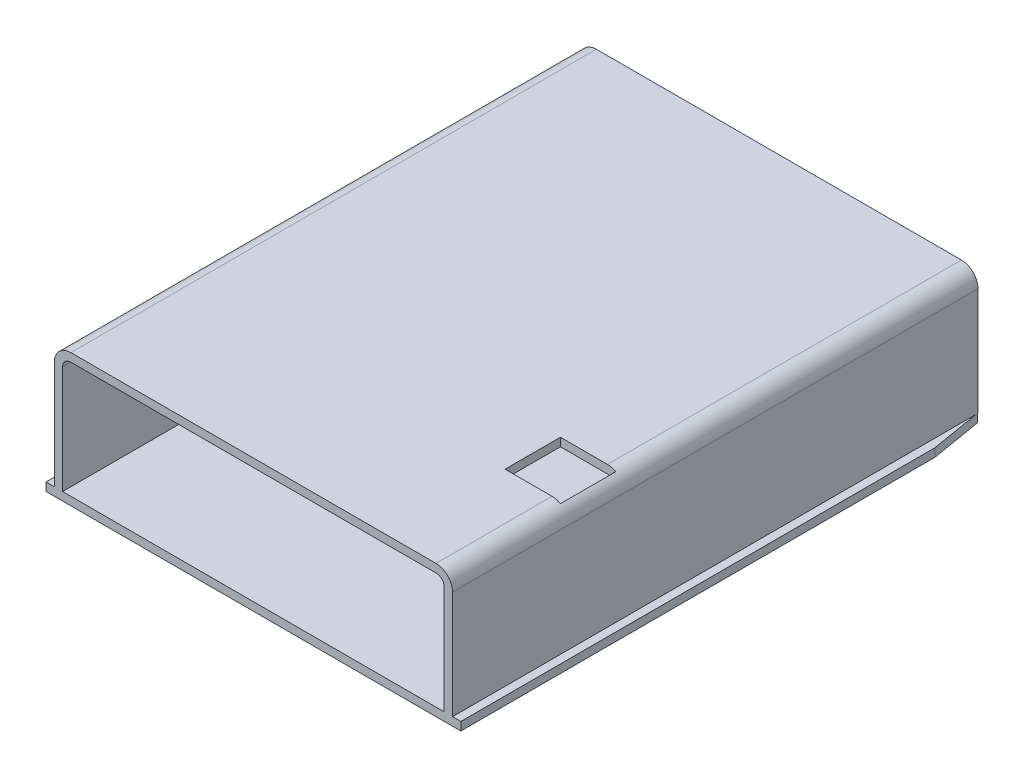
ISO-10303-21;
HEADER;
FILE_DESCRIPTION(('STEP AP214'),'2;1');
FILE_NAME('part.step','',(''),(''),'','','');
FILE_SCHEMA(('AUTOMOTIVE_DESIGN { 1 0 10303 214 1 1 1 1 }'));
ENDSEC;
DATA;
#1=APPLICATION_CONTEXT('core data for automotive mechanical design processes');
#2=APPLICATION_PROTOCOL_DEFINITION('international standard','automotive_design',2000,#1);
#3=PRODUCT_CONTEXT('',#1,'mechanical');
#4=PRODUCT('Part','Part','',(#3));
#5=PRODUCT_RELATED_PRODUCT_CATEGORY('part','',(#4));
#6=PRODUCT_DEFINITION_FORMATION('','',#4);
#7=PRODUCT_DEFINITION_CONTEXT('part definition',#1,'design');
#8=PRODUCT_DEFINITION('design','',#6,#7);
#9=PRODUCT_DEFINITION_SHAPE('','',#8);
#10=(LENGTH_UNIT() NAMED_UNIT(*) SI_UNIT(.MILLI.,.METRE.));
#11=(NAMED_UNIT(*) PLANE_ANGLE_UNIT() SI_UNIT($,.RADIAN.));
#12=(NAMED_UNIT(*) SI_UNIT($,.STERADIAN.) SOLID_ANGLE_UNIT());
#13=UNCERTAINTY_MEASURE_WITH_UNIT(LENGTH_MEASURE(1.E-05),#10,'distance_accuracy_value','');
#14=(GEOMETRIC_REPRESENTATION_CONTEXT(3) GLOBAL_UNCERTAINTY_ASSIGNED_CONTEXT((#13)) GLOBAL_UNIT_ASSIGNED_CONTEXT((#10,
#11,#12)) REPRESENTATION_CONTEXT('',''));
#15=CARTESIAN_POINT('',(0.,0.,0.));
#16=DIRECTION('',(0.,0.,1.));
#17=DIRECTION('',(1.,0.,0.));
#18=AXIS2_PLACEMENT_3D('',#15,#16,#17);
#19=CARTESIAN_POINT('',(1.5,22.5,2.));
#20=DIRECTION('',(-1.,0.,0.));
#21=DIRECTION('',(0.,-1.,0.));
#22=AXIS2_PLACEMENT_3D('',#19,#20,#21);
#23=PLANE('',#22);
#24=DIRECTION('',(0.,-1.,0.));
#25=VECTOR('',#24,1.);
#26=CARTESIAN_POINT('',(1.5,17.5,17.));
#27=LINE('',#26,#25);
#28=CARTESIAN_POINT('',(1.5,21.,17.));
#29=VERTEX_POINT('',#28);
#30=CARTESIAN_POINT('',(1.5,17.5,17.));
#31=VERTEX_POINT('',#30);
#32=EDGE_CURVE('E443',#29,#31,#27,.T.);
#33=ORIENTED_EDGE('',*,*,#32,.F.);
#34=DIRECTION('',(0.,0.,1.));
#35=VECTOR('',#34,1.);
#36=CARTESIAN_POINT('',(1.5,21.,95.));
#37=LINE('',#36,#35);
#38=CARTESIAN_POINT('',(1.5,21.,95.));
#39=VERTEX_POINT('',#38);
#40=EDGE_CURVE('E385',#29,#39,#37,.T.);
#41=ORIENTED_EDGE('',*,*,#40,.T.);
#42=DIRECTION('',(0.,-1.,0.));
#43=VECTOR('',#42,1.);
#44=CARTESIAN_POINT('',(1.5,22.5,95.));
#45=LINE('',#44,#43);
#46=CARTESIAN_POINT('',(1.5,1.5,95.));
#47=VERTEX_POINT('',#46);
#48=EDGE_CURVE('E617',#39,#47,#45,.T.);
#49=ORIENTED_EDGE('',*,*,#48,.T.);
#50=DIRECTION('',(0.,0.,1.));
#51=VECTOR('',#50,1.);
#52=CARTESIAN_POINT('',(1.5,1.5,2.));
#53=LINE('',#52,#51);
#54=CARTESIAN_POINT('',(1.5,1.5,2.));
#55=VERTEX_POINT('',#54);
#56=EDGE_CURVE('E629',#55,#47,#53,.T.);
#57=ORIENTED_EDGE('',*,*,#56,.F.);
#58=DIRECTION('',(0.,-1.,0.));
#59=VECTOR('',#58,1.);
#60=CARTESIAN_POINT('',(1.5,22.5,2.));
#61=LINE('',#60,#59);
#62=CARTESIAN_POINT('',(1.5,17.5,2.));
#63=VERTEX_POINT('',#62);
#64=EDGE_CURVE('E618',#63,#55,#61,.T.);
#65=ORIENTED_EDGE('',*,*,#64,.F.);
#66=DIRECTION('',(0.,0.,-1.));
#67=VECTOR('',#66,1.);
#68=CARTESIAN_POINT('',(1.5,17.5,16.));
#69=LINE('',#68,#67);
#70=EDGE_CURVE('E591',#31,#63,#69,.T.);
#71=ORIENTED_EDGE('',*,*,#70,.F.);
#72=EDGE_LOOP('',(#33,#41,#49,#57,#65,#71));
#73=FACE_BOUND('',#72,.T.);
#74=ADVANCED_FACE('F33',(#73),#23,.F.);
#75=CARTESIAN_POINT('',(1.5,22.5,2.));
#76=DIRECTION('',(0.,1.,0.));
#77=DIRECTION('',(0.,0.,1.));
#78=AXIS2_PLACEMENT_3D('',#75,#76,#77);
#79=PLANE('',#78);
#80=DIRECTION('',(-1.,0.,0.));
#81=VECTOR('',#80,1.);
#82=CARTESIAN_POINT('',(1.5,22.5,95.));
#83=LINE('',#82,#81);
#84=CARTESIAN_POINT('',(69.,22.5,95.));
#85=VERTEX_POINT('',#84);
#86=CARTESIAN_POINT('',(3.,22.5,95.));
#87=VERTEX_POINT('',#86);
#88=EDGE_CURVE('E621',#85,#87,#83,.T.);
#89=ORIENTED_EDGE('',*,*,#88,.T.);
#90=DIRECTION('',(0.,0.,1.));
#91=VECTOR('',#90,1.);
#92=CARTESIAN_POINT('',(3.,22.5,17.));
#93=LINE('',#92,#91);
#94=CARTESIAN_POINT('',(3.,22.5,17.));
#95=VERTEX_POINT('',#94);
#96=EDGE_CURVE('E394',#87,#95,#93,.F.);
#97=ORIENTED_EDGE('',*,*,#96,.T.);
#98=DIRECTION('',(-1.,0.,0.));
#99=VECTOR('',#98,1.);
#100=CARTESIAN_POINT('',(1.5,22.5,17.));
#101=LINE('',#100,#99);
#102=CARTESIAN_POINT('',(3.1,22.5,17.));
#103=VERTEX_POINT('',#102);
#104=EDGE_CURVE('E440',#103,#95,#101,.T.);
#105=ORIENTED_EDGE('',*,*,#104,.F.);
#106=DIRECTION('',(0.,0.,-1.));
#107=VECTOR('',#106,1.);
#108=CARTESIAN_POINT('',(3.1,22.5,17.));
#109=LINE('',#108,#107);
#110=CARTESIAN_POINT('',(3.1,22.5,16.));
#111=VERTEX_POINT('',#110);
#112=EDGE_CURVE('E448',#103,#111,#109,.T.);
#113=ORIENTED_EDGE('',*,*,#112,.T.);
#114=DIRECTION('',(-1.,0.,0.));
#115=VECTOR('',#114,1.);
#116=CARTESIAN_POINT('',(1.5,22.5,16.));
#117=LINE('',#116,#115);
#118=CARTESIAN_POINT('',(1.5,22.5,16.));
#119=VERTEX_POINT('',#118);
#120=EDGE_CURVE('E456',#111,#119,#117,.T.);
#121=ORIENTED_EDGE('',*,*,#120,.T.);
#122=DIRECTION('',(0.,0.,1.));
#123=VECTOR('',#122,1.);
#124=CARTESIAN_POINT('',(1.5,22.5,2.));
#125=LINE('',#124,#123);
#126=CARTESIAN_POINT('',(1.5,22.5,0.));
#127=VERTEX_POINT('',#126);
#128=EDGE_CURVE('E358',#127,#119,#125,.T.);
#129=ORIENTED_EDGE('',*,*,#128,.F.);
#130=DIRECTION('',(1.,0.,0.));
#131=VECTOR('',#130,1.);
#132=CARTESIAN_POINT('',(1.5,22.5,0.));
#133=LINE('',#132,#131);
#134=CARTESIAN_POINT('',(27.24,22.5,0.));
#135=VERTEX_POINT('',#134);
#136=EDGE_CURVE('E571',#127,#135,#133,.T.);
#137=ORIENTED_EDGE('',*,*,#136,.T.);
#138=DIRECTION('',(0.,0.,-1.));
#139=VECTOR('',#138,1.);
#140=CARTESIAN_POINT('',(27.24,22.5,16.));
#141=LINE('',#140,#139);
#142=CARTESIAN_POINT('',(27.24,22.5,16.));
#143=VERTEX_POINT('',#142);
#144=EDGE_CURVE('E565',#143,#135,#141,.T.);
#145=ORIENTED_EDGE('',*,*,#144,.F.);
#146=DIRECTION('',(-1.,0.,0.));
#147=VECTOR('',#146,1.);
#148=CARTESIAN_POINT('',(29.24,22.5,16.));
#149=LINE('',#148,#147);
#150=CARTESIAN_POINT('',(26.24,22.5,16.));
#151=VERTEX_POINT('',#150);
#152=EDGE_CURVE('E425',#143,#151,#149,.T.);
#153=ORIENTED_EDGE('',*,*,#152,.T.);
#154=DIRECTION('',(0.,0.,-1.));
#155=VECTOR('',#154,1.);
#156=CARTESIAN_POINT('',(26.24,22.5,17.));
#157=LINE('',#156,#155);
#158=CARTESIAN_POINT('',(26.24,22.5,17.));
#159=VERTEX_POINT('',#158);
#160=EDGE_CURVE('E466',#159,#151,#157,.T.);
#161=ORIENTED_EDGE('',*,*,#160,.F.);
#162=DIRECTION('',(-1.,0.,0.));
#163=VECTOR('',#162,1.);
#164=CARTESIAN_POINT('',(29.24,22.5,17.));
#165=LINE('',#164,#163);
#166=CARTESIAN_POINT('',(29.24,22.5,17.));
#167=VERTEX_POINT('',#166);
#168=EDGE_CURVE('E429',#167,#159,#165,.T.);
#169=ORIENTED_EDGE('',*,*,#168,.F.);
#170=DIRECTION('',(0.,0.,-1.));
#171=VECTOR('',#170,1.);
#172=CARTESIAN_POINT('',(29.24,22.5,16.));
#173=LINE('',#172,#171);
#174=CARTESIAN_POINT('',(29.24,22.5,2.));
#175=VERTEX_POINT('',#174);
#176=EDGE_CURVE('E586',#167,#175,#173,.T.);
#177=ORIENTED_EDGE('',*,*,#176,.T.);
#178=DIRECTION('',(-1.,0.,0.));
#179=VECTOR('',#178,1.);
#180=CARTESIAN_POINT('',(1.5,22.5,2.));
#181=LINE('',#180,#179);
#182=CARTESIAN_POINT('',(69.,22.5,2.));
#183=VERTEX_POINT('',#182);
#184=EDGE_CURVE('E627',#183,#175,#181,.T.);
#185=ORIENTED_EDGE('',*,*,#184,.F.);
#186=DIRECTION('',(0.,0.,1.));
#187=VECTOR('',#186,1.);
#188=CARTESIAN_POINT('',(69.,22.5,64.));
#189=LINE('',#188,#187);
#190=CARTESIAN_POINT('',(69.,22.5,64.));
#191=VERTEX_POINT('',#190);
#192=EDGE_CURVE('E388',#183,#191,#189,.T.);
#193=ORIENTED_EDGE('',*,*,#192,.T.);
#194=DIRECTION('',(-1.,0.,0.));
#195=VECTOR('',#194,1.);
#196=CARTESIAN_POINT('',(1.5,22.5,64.));
#197=LINE('',#196,#195);
#198=CARTESIAN_POINT('',(60.5,22.5,64.));
#199=VERTEX_POINT('',#198);
#200=EDGE_CURVE('E615',#191,#199,#197,.T.);
#201=ORIENTED_EDGE('',*,*,#200,.T.);
#202=DIRECTION('',(0.,0.,1.));
#203=VECTOR('',#202,1.);
#204=CARTESIAN_POINT('',(60.4999999999999,22.5,1.99999999999996));
#205=LINE('',#204,#203);
#206=CARTESIAN_POINT('',(60.5,22.5,74.));
#207=VERTEX_POINT('',#206);
#208=EDGE_CURVE('E348',#199,#207,#205,.T.);
#209=ORIENTED_EDGE('',*,*,#208,.T.);
#210=DIRECTION('',(1.,0.,0.));
#211=VECTOR('',#210,1.);
#212=CARTESIAN_POINT('',(1.5,22.5,74.));
#213=LINE('',#212,#211);
#214=CARTESIAN_POINT('',(69.,22.5,74.));
#215=VERTEX_POINT('',#214);
#216=EDGE_CURVE('E604',#207,#215,#213,.T.);
#217=ORIENTED_EDGE('',*,*,#216,.T.);
#218=DIRECTION('',(0.,0.,1.));
#219=VECTOR('',#218,1.);
#220=CARTESIAN_POINT('',(69.,22.5,95.));
#221=LINE('',#220,#219);
#222=EDGE_CURVE('E391',#215,#85,#221,.T.);
#223=ORIENTED_EDGE('',*,*,#222,.T.);
#224=EDGE_LOOP('',(#89,#97,#105,#113,#121,#129,#137,#145,#153,#161,#169,#177,#185,#193,#201,
#209,#217,#223));
#225=FACE_BOUND('',#224,.T.);
#226=ADVANCED_FACE('F510',(#225),#79,.F.);
#227=CARTESIAN_POINT('',(0.,0.,95.));
#228=DIRECTION('',(1.,0.,0.));
#229=DIRECTION('',(0.,0.,-1.));
#230=AXIS2_PLACEMENT_3D('',#227,#228,#229);
#231=PLANE('',#230);
#232=DIRECTION('',(0.,-1.,0.));
#233=VECTOR('',#232,1.);
#234=CARTESIAN_POINT('',(0.,0.,95.));
#235=LINE('',#234,#233);
#236=CARTESIAN_POINT('',(0.,21.,95.));
#237=VERTEX_POINT('',#236);
#238=CARTESIAN_POINT('',(0.,1.5,95.));
#239=VERTEX_POINT('',#238);
#240=EDGE_CURVE('E341',#237,#239,#235,.T.);
#241=ORIENTED_EDGE('',*,*,#240,.F.);
#242=DIRECTION('',(0.,0.,-1.));
#243=VECTOR('',#242,1.);
#244=CARTESIAN_POINT('',(0.,21.,95.));
#245=LINE('',#244,#243);
#246=CARTESIAN_POINT('',(0.,21.,0.));
#247=VERTEX_POINT('',#246);
#248=EDGE_CURVE('E360',#237,#247,#245,.T.);
#249=ORIENTED_EDGE('',*,*,#248,.T.);
#250=DIRECTION('',(0.,-1.,0.));
#251=VECTOR('',#250,1.);
#252=CARTESIAN_POINT('',(0.,0.,0.));
#253=LINE('',#252,#251);
#254=CARTESIAN_POINT('',(0.,1.5,0.));
#255=VERTEX_POINT('',#254);
#256=EDGE_CURVE('E344',#247,#255,#253,.T.);
#257=ORIENTED_EDGE('',*,*,#256,.T.);
#258=DIRECTION('',(0.,0.,-1.));
#259=VECTOR('',#258,1.);
#260=CARTESIAN_POINT('',(0.,1.5,95.));
#261=LINE('',#260,#259);
#262=EDGE_CURVE('E303',#239,#255,#261,.T.);
#263=ORIENTED_EDGE('',*,*,#262,.F.);
#264=EDGE_LOOP('',(#241,#249,#257,#263));
#265=FACE_BOUND('',#264,.T.);
#266=ADVANCED_FACE('F489',(#265),#231,.F.);
#267=ORIENTED_EDGE('',*,*,#128,.T.);
#268=DIRECTION('',(0.,-1.,0.));
#269=VECTOR('',#268,1.);
#270=CARTESIAN_POINT('',(1.5,17.5,16.));
#271=LINE('',#270,#269);
#272=CARTESIAN_POINT('',(1.5,19.5,16.));
#273=VERTEX_POINT('',#272);
#274=EDGE_CURVE('E430',#119,#273,#271,.T.);
#275=ORIENTED_EDGE('',*,*,#274,.T.);
#276=DIRECTION('',(0.,0.,-1.));
#277=VECTOR('',#276,1.);
#278=CARTESIAN_POINT('',(1.5,19.5,16.));
#279=LINE('',#278,#277);
#280=CARTESIAN_POINT('',(1.5,19.5,0.));
#281=VERTEX_POINT('',#280);
#282=EDGE_CURVE('E577',#273,#281,#279,.T.);
#283=ORIENTED_EDGE('',*,*,#282,.T.);
#284=DIRECTION('',(0.,1.,0.));
#285=VECTOR('',#284,1.);
#286=CARTESIAN_POINT('',(1.5,22.5,0.));
#287=LINE('',#286,#285);
#288=EDGE_CURVE('E287',#281,#127,#287,.T.);
#289=ORIENTED_EDGE('',*,*,#288,.T.);
#290=EDGE_LOOP('',(#267,#275,#283,#289));
#291=FACE_BOUND('',#290,.T.);
#292=ADVANCED_FACE('F513',(#291),#23,.F.);
#293=CARTESIAN_POINT('',(0.,0.,2.));
#294=DIRECTION('',(0.,0.,1.));
#295=DIRECTION('',(1.,0.,0.));
#296=AXIS2_PLACEMENT_3D('',#293,#294,#295);
#297=PLANE('',#296);
#298=DIRECTION('',(0.,1.,0.));
#299=VECTOR('',#298,1.);
#300=CARTESIAN_POINT('',(70.5,22.5,2.));
#301=LINE('',#300,#299);
#302=CARTESIAN_POINT('',(70.5,1.5,2.));
#303=VERTEX_POINT('',#302);
#304=CARTESIAN_POINT('',(70.5,21.,2.));
#305=VERTEX_POINT('',#304);
#306=EDGE_CURVE('E624',#303,#305,#301,.T.);
#307=ORIENTED_EDGE('',*,*,#306,.T.);
#308=CARTESIAN_POINT('',(69.,21.,2.));
#309=DIRECTION('',(0.,0.,1.));
#310=DIRECTION('',(1.,0.,0.));
#311=AXIS2_PLACEMENT_3D('',#308,#309,#310);
#312=CIRCLE('',#311,1.5);
#313=EDGE_CURVE('E403',#305,#183,#312,.T.);
#314=ORIENTED_EDGE('',*,*,#313,.T.);
#315=ORIENTED_EDGE('',*,*,#184,.T.);
#316=DIRECTION('',(0.,1.,0.));
#317=VECTOR('',#316,1.);
#318=CARTESIAN_POINT('',(29.24,22.5,2.));
#319=LINE('',#318,#317);
#320=CARTESIAN_POINT('',(29.24,17.5,2.));
#321=VERTEX_POINT('',#320);
#322=EDGE_CURVE('E583',#321,#175,#319,.T.);
#323=ORIENTED_EDGE('',*,*,#322,.F.);
#324=DIRECTION('',(1.,0.,0.));
#325=VECTOR('',#324,1.);
#326=CARTESIAN_POINT('',(1.5,17.5,2.));
#327=LINE('',#326,#325);
#328=EDGE_CURVE('E579',#63,#321,#327,.T.);
#329=ORIENTED_EDGE('',*,*,#328,.F.);
#330=ORIENTED_EDGE('',*,*,#64,.T.);
#331=DIRECTION('',(1.,0.,0.));
#332=VECTOR('',#331,1.);
#333=CARTESIAN_POINT('',(1.5,1.5,2.));
#334=LINE('',#333,#332);
#335=EDGE_CURVE('E620',#55,#303,#334,.T.);
#336=ORIENTED_EDGE('',*,*,#335,.T.);
#337=EDGE_LOOP('',(#307,#314,#315,#323,#329,#330,#336));
#338=FACE_BOUND('',#337,.T.);
#339=ADVANCED_FACE('F523',(#338),#297,.T.);
#340=CARTESIAN_POINT('',(0.,0.,95.));
#341=DIRECTION('',(0.,1.,0.));
#342=DIRECTION('',(0.,0.,1.));
#343=AXIS2_PLACEMENT_3D('',#340,#341,#342);
#344=PLANE('',#343);
#345=DIRECTION('',(1.,0.,0.));
#346=VECTOR('',#345,1.);
#347=CARTESIAN_POINT('',(0.,0.,0.));
#348=LINE('',#347,#346);
#349=CARTESIAN_POINT('',(0.,0.,0.));
#350=VERTEX_POINT('',#349);
#351=CARTESIAN_POINT('',(71.9347971969597,0.,0.));
#352=VERTEX_POINT('',#351);
#353=EDGE_CURVE('E339',#350,#352,#348,.T.);
#354=ORIENTED_EDGE('',*,*,#353,.T.);
#355=DIRECTION('',(-0.166507387012407,0.,-0.986040207126617));
#356=VECTOR('',#355,1.);
#357=CARTESIAN_POINT('',(73.5,0.,9.26897553193839));
#358=LINE('',#357,#356);
#359=CARTESIAN_POINT('',(73.5,0.,9.26897553193839));
#360=VERTEX_POINT('',#359);
#361=EDGE_CURVE('E1013',#360,#352,#358,.T.);
#362=ORIENTED_EDGE('',*,*,#361,.F.);
#363=DIRECTION('',(0.,0.,-1.));
#364=VECTOR('',#363,1.);
#365=CARTESIAN_POINT('',(73.5,0.,95.));
#366=LINE('',#365,#364);
#367=CARTESIAN_POINT('',(73.5,0.,95.));
#368=VERTEX_POINT('',#367);
#369=EDGE_CURVE('E278',#368,#360,#366,.T.);
#370=ORIENTED_EDGE('',*,*,#369,.F.);
#371=DIRECTION('',(1.,0.,0.));
#372=VECTOR('',#371,1.);
#373=CARTESIAN_POINT('',(0.,0.,95.));
#374=LINE('',#373,#372);
#375=CARTESIAN_POINT('',(-1.5,0.,95.));
#376=VERTEX_POINT('',#375);
#377=EDGE_CURVE('E488',#376,#368,#374,.T.);
#378=ORIENTED_EDGE('',*,*,#377,.F.);
#379=DIRECTION('',(0.,0.,-1.));
#380=VECTOR('',#379,1.);
#381=CARTESIAN_POINT('',(-1.5,0.,95.));
#382=LINE('',#381,#380);
#383=CARTESIAN_POINT('',(-1.5,0.,9.26897553193839));
#384=VERTEX_POINT('',#383);
#385=EDGE_CURVE('E319',#376,#384,#382,.T.);
#386=ORIENTED_EDGE('',*,*,#385,.T.);
#387=DIRECTION('',(-0.159751830859126,0.,0.987157207610397));
#388=VECTOR('',#387,1.);
#389=CARTESIAN_POINT('',(0.,0.,0.));
#390=LINE('',#389,#388);
#391=EDGE_CURVE('E59',#350,#384,#390,.T.);
#392=ORIENTED_EDGE('',*,*,#391,.F.);
#393=EDGE_LOOP('',(#354,#362,#370,#378,#386,#392));
#394=FACE_BOUND('',#393,.T.);
#395=ADVANCED_FACE('F495',(#394),#344,.F.);
#396=CARTESIAN_POINT('',(72.,0.,95.));
#397=DIRECTION('',(-1.,0.,0.));
#398=DIRECTION('',(0.,0.,1.));
#399=AXIS2_PLACEMENT_3D('',#396,#397,#398);
#400=PLANE('',#399);
#401=DIRECTION('',(0.,1.,0.));
#402=VECTOR('',#401,1.);
#403=CARTESIAN_POINT('',(72.,0.,0.));
#404=LINE('',#403,#402);
#405=CARTESIAN_POINT('',(72.,1.5,0.));
#406=VERTEX_POINT('',#405);
#407=CARTESIAN_POINT('',(72.,21.,0.));
#408=VERTEX_POINT('',#407);
#409=EDGE_CURVE('E326',#406,#408,#404,.T.);
#410=ORIENTED_EDGE('',*,*,#409,.T.);
#411=DIRECTION('',(0.,0.,-1.));
#412=VECTOR('',#411,1.);
#413=CARTESIAN_POINT('',(72.,21.,95.));
#414=LINE('',#413,#412);
#415=CARTESIAN_POINT('',(72.,21.,95.));
#416=VERTEX_POINT('',#415);
#417=EDGE_CURVE('E383',#408,#416,#414,.F.);
#418=ORIENTED_EDGE('',*,*,#417,.T.);
#419=DIRECTION('',(0.,1.,0.));
#420=VECTOR('',#419,1.);
#421=CARTESIAN_POINT('',(72.,0.,95.));
#422=LINE('',#421,#420);
#423=CARTESIAN_POINT('',(72.,1.5,95.));
#424=VERTEX_POINT('',#423);
#425=EDGE_CURVE('E298',#424,#416,#422,.T.);
#426=ORIENTED_EDGE('',*,*,#425,.F.);
#427=DIRECTION('',(0.,0.,-1.));
#428=VECTOR('',#427,1.);
#429=CARTESIAN_POINT('',(72.,1.5,95.));
#430=LINE('',#429,#428);
#431=CARTESIAN_POINT('',(72.,1.5,0.386124523173742));
#432=VERTEX_POINT('',#431);
#433=EDGE_CURVE('E285',#424,#432,#430,.T.);
#434=ORIENTED_EDGE('',*,*,#433,.T.);
#435=EDGE_CURVE('E37',#432,#406,#430,.T.);
#436=ORIENTED_EDGE('',*,*,#435,.T.);
#437=EDGE_LOOP('',(#410,#418,#426,#434,#436));
#438=FACE_BOUND('',#437,.T.);
#439=ADVANCED_FACE('F325',(#438),#400,.F.);
#440=CARTESIAN_POINT('',(0.,24.,95.));
#441=DIRECTION('',(0.,-1.,0.));
#442=DIRECTION('',(0.,0.,-1.));
#443=AXIS2_PLACEMENT_3D('',#440,#441,#442);
#444=PLANE('',#443);
#445=DIRECTION('',(-1.,0.,0.));
#446=VECTOR('',#445,1.);
#447=CARTESIAN_POINT('',(0.,24.,0.));
#448=LINE('',#447,#446);
#449=CARTESIAN_POINT('',(69.,24.,0.));
#450=VERTEX_POINT('',#449);
#451=CARTESIAN_POINT('',(3.,24.,0.));
#452=VERTEX_POINT('',#451);
#453=EDGE_CURVE('E338',#450,#452,#448,.T.);
#454=ORIENTED_EDGE('',*,*,#453,.T.);
#455=DIRECTION('',(0.,0.,-1.));
#456=VECTOR('',#455,1.);
#457=CARTESIAN_POINT('',(3.,24.,95.));
#458=LINE('',#457,#456);
#459=CARTESIAN_POINT('',(3.,24.,95.));
#460=VERTEX_POINT('',#459);
#461=EDGE_CURVE('E371',#452,#460,#458,.F.);
#462=ORIENTED_EDGE('',*,*,#461,.T.);
#463=DIRECTION('',(-1.,0.,0.));
#464=VECTOR('',#463,1.);
#465=CARTESIAN_POINT('',(0.,24.,95.));
#466=LINE('',#465,#464);
#467=CARTESIAN_POINT('',(69.,24.,95.));
#468=VERTEX_POINT('',#467);
#469=EDGE_CURVE('E353',#468,#460,#466,.T.);
#470=ORIENTED_EDGE('',*,*,#469,.F.);
#471=DIRECTION('',(0.,0.,-1.));
#472=VECTOR('',#471,1.);
#473=CARTESIAN_POINT('',(69.,24.,95.));
#474=LINE('',#473,#472);
#475=CARTESIAN_POINT('',(69.,24.,74.));
#476=VERTEX_POINT('',#475);
#477=EDGE_CURVE('E368',#468,#476,#474,.T.);
#478=ORIENTED_EDGE('',*,*,#477,.T.);
#479=DIRECTION('',(1.,0.,0.));
#480=VECTOR('',#479,1.);
#481=CARTESIAN_POINT('',(60.5,24.,74.));
#482=LINE('',#481,#480);
#483=CARTESIAN_POINT('',(60.5,24.,74.));
#484=VERTEX_POINT('',#483);
#485=EDGE_CURVE('E595',#484,#476,#482,.T.);
#486=ORIENTED_EDGE('',*,*,#485,.F.);
#487=DIRECTION('',(0.,0.,1.));
#488=VECTOR('',#487,1.);
#489=CARTESIAN_POINT('',(60.5,24.,64.));
#490=LINE('',#489,#488);
#491=CARTESIAN_POINT('',(60.5,24.,64.));
#492=VERTEX_POINT('',#491);
#493=EDGE_CURVE('E593',#492,#484,#490,.T.);
#494=ORIENTED_EDGE('',*,*,#493,.F.);
#495=DIRECTION('',(-1.,0.,0.));
#496=VECTOR('',#495,1.);
#497=CARTESIAN_POINT('',(60.5,24.,64.));
#498=LINE('',#497,#496);
#499=CARTESIAN_POINT('',(69.,24.,64.));
#500=VERTEX_POINT('',#499);
#501=EDGE_CURVE('E598',#500,#492,#498,.T.);
#502=ORIENTED_EDGE('',*,*,#501,.F.);
#503=DIRECTION('',(0.,0.,-1.));
#504=VECTOR('',#503,1.);
#505=CARTESIAN_POINT('',(69.,24.,95.));
#506=LINE('',#505,#504);
#507=EDGE_CURVE('E366',#500,#450,#506,.T.);
#508=ORIENTED_EDGE('',*,*,#507,.T.);
#509=EDGE_LOOP('',(#454,#462,#470,#478,#486,#494,#502,#508));
#510=FACE_BOUND('',#509,.T.);
#511=ADVANCED_FACE('F662',(#510),#444,.F.);
#512=CARTESIAN_POINT('',(0.,0.,95.));
#513=DIRECTION('',(0.,0.,-1.));
#514=DIRECTION('',(-1.,0.,0.));
#515=AXIS2_PLACEMENT_3D('',#512,#513,#514);
#516=PLANE('',#515);
#517=DIRECTION('',(1.,0.,0.));
#518=VECTOR('',#517,1.);
#519=CARTESIAN_POINT('',(1.5,1.5,95.));
#520=LINE('',#519,#518);
#521=CARTESIAN_POINT('',(70.5,1.5,95.));
#522=VERTEX_POINT('',#521);
#523=EDGE_CURVE('E631',#47,#522,#520,.T.);
#524=ORIENTED_EDGE('',*,*,#523,.F.);
#525=ORIENTED_EDGE('',*,*,#48,.F.);
#526=CARTESIAN_POINT('',(3.,21.,95.));
#527=DIRECTION('',(0.,0.,-1.));
#528=DIRECTION('',(-1.,0.,0.));
#529=AXIS2_PLACEMENT_3D('',#526,#527,#528);
#530=CIRCLE('',#529,1.5);
#531=EDGE_CURVE('E405',#39,#87,#530,.T.);
#532=ORIENTED_EDGE('',*,*,#531,.T.);
#533=ORIENTED_EDGE('',*,*,#88,.F.);
#534=CARTESIAN_POINT('',(69.,21.,95.));
#535=DIRECTION('',(0.,0.,-1.));
#536=DIRECTION('',(-1.,0.,0.));
#537=AXIS2_PLACEMENT_3D('',#534,#535,#536);
#538=CIRCLE('',#537,1.5);
#539=CARTESIAN_POINT('',(70.5,21.,95.));
#540=VERTEX_POINT('',#539);
#541=EDGE_CURVE('E407',#85,#540,#538,.T.);
#542=ORIENTED_EDGE('',*,*,#541,.T.);
#543=DIRECTION('',(0.,1.,0.));
#544=VECTOR('',#543,1.);
#545=CARTESIAN_POINT('',(70.5,22.5,95.));
#546=LINE('',#545,#544);
#547=EDGE_CURVE('E634',#522,#540,#546,.T.);
#548=ORIENTED_EDGE('',*,*,#547,.F.);
#549=EDGE_LOOP('',(#524,#525,#532,#533,#542,#548));
#550=FACE_BOUND('',#549,.T.);
#551=ORIENTED_EDGE('',*,*,#469,.T.);
#552=CARTESIAN_POINT('',(3.,21.,95.));
#553=DIRECTION('',(0.,0.,-1.));
#554=DIRECTION('',(-1.,0.,0.));
#555=AXIS2_PLACEMENT_3D('',#552,#553,#554);
#556=CIRCLE('',#555,3.);
#557=EDGE_CURVE('E375',#460,#237,#556,.F.);
#558=ORIENTED_EDGE('',*,*,#557,.T.);
#559=ORIENTED_EDGE('',*,*,#240,.T.);
#560=DIRECTION('',(1.,0.,0.));
#561=VECTOR('',#560,1.);
#562=CARTESIAN_POINT('',(0.,1.5,95.));
#563=LINE('',#562,#561);
#564=CARTESIAN_POINT('',(-1.5,1.5,95.));
#565=VERTEX_POINT('',#564);
#566=EDGE_CURVE('E310',#565,#239,#563,.T.);
#567=ORIENTED_EDGE('',*,*,#566,.F.);
#568=DIRECTION('',(0.,1.,0.));
#569=VECTOR('',#568,1.);
#570=CARTESIAN_POINT('',(-1.5,1.5,95.));
#571=LINE('',#570,#569);
#572=EDGE_CURVE('E315',#376,#565,#571,.T.);
#573=ORIENTED_EDGE('',*,*,#572,.F.);
#574=ORIENTED_EDGE('',*,*,#377,.T.);
#575=DIRECTION('',(0.,-1.,0.));
#576=VECTOR('',#575,1.);
#577=CARTESIAN_POINT('',(73.5,1.5,95.));
#578=LINE('',#577,#576);
#579=CARTESIAN_POINT('',(73.5,1.5,95.));
#580=VERTEX_POINT('',#579);
#581=EDGE_CURVE('E302',#580,#368,#578,.T.);
#582=ORIENTED_EDGE('',*,*,#581,.F.);
#583=DIRECTION('',(1.,0.,0.));
#584=VECTOR('',#583,1.);
#585=CARTESIAN_POINT('',(72.,1.5,95.));
#586=LINE('',#585,#584);
#587=EDGE_CURVE('E284',#424,#580,#586,.T.);
#588=ORIENTED_EDGE('',*,*,#587,.F.);
#589=ORIENTED_EDGE('',*,*,#425,.T.);
#590=CARTESIAN_POINT('',(69.,21.,95.));
#591=DIRECTION('',(0.,0.,-1.));
#592=DIRECTION('',(-1.,0.,0.));
#593=AXIS2_PLACEMENT_3D('',#590,#591,#592);
#594=CIRCLE('',#593,3.);
#595=EDGE_CURVE('E373',#416,#468,#594,.F.);
#596=ORIENTED_EDGE('',*,*,#595,.T.);
#597=EDGE_LOOP('',(#551,#558,#559,#567,#573,#574,#582,#588,#589,#596));
#598=FACE_BOUND('',#597,.T.);
#599=ADVANCED_FACE('F483',(#550,#598),#516,.F.);
#600=CARTESIAN_POINT('',(0.,0.,0.));
#601=DIRECTION('',(0.,0.,-1.));
#602=DIRECTION('',(-1.,0.,0.));
#603=AXIS2_PLACEMENT_3D('',#600,#601,#602);
#604=PLANE('',#603);
#605=DIRECTION('',(0.,-1.,0.));
#606=VECTOR('',#605,1.);
#607=CARTESIAN_POINT('',(71.9347971969597,1.5,0.));
#608=LINE('',#607,#606);
#609=CARTESIAN_POINT('',(71.9347971969597,1.5,0.));
#610=VERTEX_POINT('',#609);
#611=EDGE_CURVE('E279',#610,#352,#608,.T.);
#612=ORIENTED_EDGE('',*,*,#611,.T.);
#613=ORIENTED_EDGE('',*,*,#353,.F.);
#614=DIRECTION('',(0.,-1.,0.));
#615=VECTOR('',#614,1.);
#616=CARTESIAN_POINT('',(0.,1.5,0.));
#617=LINE('',#616,#615);
#618=EDGE_CURVE('E410',#255,#350,#617,.T.);
#619=ORIENTED_EDGE('',*,*,#618,.F.);
#620=ORIENTED_EDGE('',*,*,#256,.F.);
#621=CARTESIAN_POINT('',(3.,21.,0.));
#622=DIRECTION('',(0.,0.,-1.));
#623=DIRECTION('',(-1.,0.,0.));
#624=AXIS2_PLACEMENT_3D('',#621,#622,#623);
#625=CIRCLE('',#624,3.);
#626=EDGE_CURVE('E364',#247,#452,#625,.T.);
#627=ORIENTED_EDGE('',*,*,#626,.T.);
#628=ORIENTED_EDGE('',*,*,#453,.F.);
#629=CARTESIAN_POINT('',(69.,21.,0.));
#630=DIRECTION('',(0.,0.,-1.));
#631=DIRECTION('',(-1.,0.,0.));
#632=AXIS2_PLACEMENT_3D('',#629,#630,#631);
#633=CIRCLE('',#632,3.);
#634=EDGE_CURVE('E337',#450,#408,#633,.T.);
#635=ORIENTED_EDGE('',*,*,#634,.T.);
#636=ORIENTED_EDGE('',*,*,#409,.F.);
#637=DIRECTION('',(1.,0.,0.));
#638=VECTOR('',#637,1.);
#639=CARTESIAN_POINT('',(71.9347971969597,1.5,0.));
#640=LINE('',#639,#638);
#641=EDGE_CURVE('E269',#610,#406,#640,.T.);
#642=ORIENTED_EDGE('',*,*,#641,.F.);
#643=EDGE_LOOP('',(#612,#613,#619,#620,#627,#628,#635,#636,#642));
#644=FACE_BOUND('',#643,.T.);
#645=ORIENTED_EDGE('',*,*,#288,.F.);
#646=DIRECTION('',(-1.,0.,0.));
#647=VECTOR('',#646,1.);
#648=CARTESIAN_POINT('',(1.5,19.5,0.));
#649=LINE('',#648,#647);
#650=CARTESIAN_POINT('',(27.24,19.5,0.));
#651=VERTEX_POINT('',#650);
#652=EDGE_CURVE('E568',#651,#281,#649,.T.);
#653=ORIENTED_EDGE('',*,*,#652,.F.);
#654=DIRECTION('',(0.,-1.,0.));
#655=VECTOR('',#654,1.);
#656=CARTESIAN_POINT('',(27.24,22.5,0.));
#657=LINE('',#656,#655);
#658=EDGE_CURVE('E573',#135,#651,#657,.T.);
#659=ORIENTED_EDGE('',*,*,#658,.F.);
#660=ORIENTED_EDGE('',*,*,#136,.F.);
#661=EDGE_LOOP('',(#645,#653,#659,#660));
#662=FACE_BOUND('',#661,.T.);
#663=ADVANCED_FACE('F333',(#644,#662),#604,.T.);
#664=CARTESIAN_POINT('',(70.5,22.5,2.));
#665=DIRECTION('',(1.,0.,0.));
#666=DIRECTION('',(0.,0.,-1.));
#667=AXIS2_PLACEMENT_3D('',#664,#665,#666);
#668=PLANE('',#667);
#669=ORIENTED_EDGE('',*,*,#547,.T.);
#670=DIRECTION('',(0.,0.,1.));
#671=VECTOR('',#670,1.);
#672=CARTESIAN_POINT('',(70.5,21.,74.));
#673=LINE('',#672,#671);
#674=CARTESIAN_POINT('',(70.5,21.,74.));
#675=VERTEX_POINT('',#674);
#676=EDGE_CURVE('E400',#540,#675,#673,.F.);
#677=ORIENTED_EDGE('',*,*,#676,.T.);
#678=DIRECTION('',(0.,1.,0.));
#679=VECTOR('',#678,1.);
#680=CARTESIAN_POINT('',(70.5,22.,74.));
#681=LINE('',#680,#679);
#682=CARTESIAN_POINT('',(70.5,23.5980762113533,74.));
#683=VERTEX_POINT('',#682);
#684=EDGE_CURVE('E608',#675,#683,#681,.T.);
#685=ORIENTED_EDGE('',*,*,#684,.T.);
#686=DIRECTION('',(0.,0.,-1.));
#687=VECTOR('',#686,1.);
#688=CARTESIAN_POINT('',(70.5,23.5980762113533,74.));
#689=LINE('',#688,#687);
#690=CARTESIAN_POINT('',(70.5,23.5980762113533,64.));
#691=VERTEX_POINT('',#690);
#692=EDGE_CURVE('E379',#683,#691,#689,.T.);
#693=ORIENTED_EDGE('',*,*,#692,.T.);
#694=DIRECTION('',(0.,1.,0.));
#695=VECTOR('',#694,1.);
#696=CARTESIAN_POINT('',(70.5,22.,64.));
#697=LINE('',#696,#695);
#698=CARTESIAN_POINT('',(70.5,21.,64.));
#699=VERTEX_POINT('',#698);
#700=EDGE_CURVE('E605',#699,#691,#697,.T.);
#701=ORIENTED_EDGE('',*,*,#700,.F.);
#702=DIRECTION('',(0.,0.,1.));
#703=VECTOR('',#702,1.);
#704=CARTESIAN_POINT('',(70.5,21.,2.));
#705=LINE('',#704,#703);
#706=EDGE_CURVE('E398',#699,#305,#705,.F.);
#707=ORIENTED_EDGE('',*,*,#706,.T.);
#708=ORIENTED_EDGE('',*,*,#306,.F.);
#709=DIRECTION('',(0.,0.,1.));
#710=VECTOR('',#709,1.);
#711=CARTESIAN_POINT('',(70.5,1.5,2.));
#712=LINE('',#711,#710);
#713=EDGE_CURVE('E538',#303,#522,#712,.T.);
#714=ORIENTED_EDGE('',*,*,#713,.T.);
#715=EDGE_LOOP('',(#669,#677,#685,#693,#701,#707,#708,#714));
#716=FACE_BOUND('',#715,.T.);
#717=ADVANCED_FACE('F700',(#716),#668,.F.);
#718=CARTESIAN_POINT('',(1.5,1.5,2.));
#719=DIRECTION('',(0.,-1.,0.));
#720=DIRECTION('',(0.,0.,-1.));
#721=AXIS2_PLACEMENT_3D('',#718,#719,#720);
#722=PLANE('',#721);
#723=ORIENTED_EDGE('',*,*,#523,.T.);
#724=ORIENTED_EDGE('',*,*,#713,.F.);
#725=ORIENTED_EDGE('',*,*,#335,.F.);
#726=ORIENTED_EDGE('',*,*,#56,.T.);
#727=EDGE_LOOP('',(#723,#724,#725,#726));
#728=FACE_BOUND('',#727,.T.);
#729=ADVANCED_FACE('F706',(#728),#722,.F.);
#730=CARTESIAN_POINT('',(60.5,22.,64.));
#731=DIRECTION('',(-1.,0.,0.));
#732=DIRECTION('',(0.,0.,1.));
#733=AXIS2_PLACEMENT_3D('',#730,#731,#732);
#734=PLANE('',#733);
#735=DIRECTION('',(0.,1.,0.));
#736=VECTOR('',#735,1.);
#737=CARTESIAN_POINT('',(60.5,22.,64.));
#738=LINE('',#737,#736);
#739=EDGE_CURVE('E601',#199,#492,#738,.T.);
#740=ORIENTED_EDGE('',*,*,#739,.T.);
#741=ORIENTED_EDGE('',*,*,#493,.T.);
#742=DIRECTION('',(0.,1.,0.));
#743=VECTOR('',#742,1.);
#744=CARTESIAN_POINT('',(60.5,22.,74.));
#745=LINE('',#744,#743);
#746=EDGE_CURVE('E600',#207,#484,#745,.T.);
#747=ORIENTED_EDGE('',*,*,#746,.F.);
#748=ORIENTED_EDGE('',*,*,#208,.F.);
#749=EDGE_LOOP('',(#740,#741,#747,#748));
#750=FACE_BOUND('',#749,.T.);
#751=ADVANCED_FACE('F654',(#750),#734,.F.);
#752=CARTESIAN_POINT('',(60.5,22.,64.));
#753=DIRECTION('',(0.,0.,-1.));
#754=DIRECTION('',(-1.,0.,0.));
#755=AXIS2_PLACEMENT_3D('',#752,#753,#754);
#756=PLANE('',#755);
#757=ORIENTED_EDGE('',*,*,#700,.T.);
#758=CARTESIAN_POINT('',(69.,21.,64.));
#759=DIRECTION('',(0.,0.,-1.));
#760=DIRECTION('',(-1.,0.,0.));
#761=AXIS2_PLACEMENT_3D('',#758,#759,#760);
#762=CIRCLE('',#761,3.);
#763=EDGE_CURVE('E381',#691,#500,#762,.F.);
#764=ORIENTED_EDGE('',*,*,#763,.T.);
#765=ORIENTED_EDGE('',*,*,#501,.T.);
#766=ORIENTED_EDGE('',*,*,#739,.F.);
#767=ORIENTED_EDGE('',*,*,#200,.F.);
#768=CARTESIAN_POINT('',(69.,21.,64.));
#769=DIRECTION('',(0.,0.,-1.));
#770=DIRECTION('',(-1.,0.,0.));
#771=AXIS2_PLACEMENT_3D('',#768,#769,#770);
#772=CIRCLE('',#771,1.5);
#773=EDGE_CURVE('E11',#191,#699,#772,.T.);
#774=ORIENTED_EDGE('',*,*,#773,.T.);
#775=EDGE_LOOP('',(#757,#764,#765,#766,#767,#774));
#776=FACE_BOUND('',#775,.T.);
#777=ADVANCED_FACE('F657',(#776),#756,.F.);
#778=CARTESIAN_POINT('',(60.5,22.,74.));
#779=DIRECTION('',(0.,0.,1.));
#780=DIRECTION('',(1.,0.,0.));
#781=AXIS2_PLACEMENT_3D('',#778,#779,#780);
#782=PLANE('',#781);
#783=ORIENTED_EDGE('',*,*,#485,.T.);
#784=CARTESIAN_POINT('',(69.,21.,74.));
#785=DIRECTION('',(0.,0.,1.));
#786=DIRECTION('',(1.,0.,0.));
#787=AXIS2_PLACEMENT_3D('',#784,#785,#786);
#788=CIRCLE('',#787,3.);
#789=EDGE_CURVE('E377',#476,#683,#788,.F.);
#790=ORIENTED_EDGE('',*,*,#789,.T.);
#791=ORIENTED_EDGE('',*,*,#684,.F.);
#792=CARTESIAN_POINT('',(69.,21.,74.));
#793=DIRECTION('',(0.,0.,1.));
#794=DIRECTION('',(1.,0.,0.));
#795=AXIS2_PLACEMENT_3D('',#792,#793,#794);
#796=CIRCLE('',#795,1.5);
#797=EDGE_CURVE('E43',#675,#215,#796,.T.);
#798=ORIENTED_EDGE('',*,*,#797,.T.);
#799=ORIENTED_EDGE('',*,*,#216,.F.);
#800=ORIENTED_EDGE('',*,*,#746,.T.);
#801=EDGE_LOOP('',(#783,#790,#791,#798,#799,#800));
#802=FACE_BOUND('',#801,.T.);
#803=ADVANCED_FACE('F669',(#802),#782,.F.);
#804=CARTESIAN_POINT('',(1.5,17.5,16.));
#805=DIRECTION('',(0.,1.,0.));
#806=DIRECTION('',(0.,0.,1.));
#807=AXIS2_PLACEMENT_3D('',#804,#805,#806);
#808=PLANE('',#807);
#809=ORIENTED_EDGE('',*,*,#328,.T.);
#810=DIRECTION('',(0.,0.,-1.));
#811=VECTOR('',#810,1.);
#812=CARTESIAN_POINT('',(29.24,17.5,16.));
#813=LINE('',#812,#811);
#814=CARTESIAN_POINT('',(29.24,17.5,17.));
#815=VERTEX_POINT('',#814);
#816=EDGE_CURVE('E589',#815,#321,#813,.T.);
#817=ORIENTED_EDGE('',*,*,#816,.F.);
#818=DIRECTION('',(1.,0.,0.));
#819=VECTOR('',#818,1.);
#820=CARTESIAN_POINT('',(1.5,17.5,17.));
#821=LINE('',#820,#819);
#822=EDGE_CURVE('E445',#31,#815,#821,.T.);
#823=ORIENTED_EDGE('',*,*,#822,.F.);
#824=ORIENTED_EDGE('',*,*,#70,.T.);
#825=EDGE_LOOP('',(#809,#817,#823,#824));
#826=FACE_BOUND('',#825,.T.);
#827=ADVANCED_FACE('F736',(#826),#808,.F.);
#828=CARTESIAN_POINT('',(29.24,22.5,16.));
#829=DIRECTION('',(-1.,0.,0.));
#830=DIRECTION('',(0.,0.,1.));
#831=AXIS2_PLACEMENT_3D('',#828,#829,#830);
#832=PLANE('',#831);
#833=ORIENTED_EDGE('',*,*,#322,.T.);
#834=ORIENTED_EDGE('',*,*,#176,.F.);
#835=DIRECTION('',(0.,1.,0.));
#836=VECTOR('',#835,1.);
#837=CARTESIAN_POINT('',(29.24,22.5,17.));
#838=LINE('',#837,#836);
#839=EDGE_CURVE('E426',#815,#167,#838,.T.);
#840=ORIENTED_EDGE('',*,*,#839,.F.);
#841=ORIENTED_EDGE('',*,*,#816,.T.);
#842=EDGE_LOOP('',(#833,#834,#840,#841));
#843=FACE_BOUND('',#842,.T.);
#844=ADVANCED_FACE('F691',(#843),#832,.F.);
#845=CARTESIAN_POINT('',(1.5,19.5,16.));
#846=DIRECTION('',(0.,-1.,0.));
#847=DIRECTION('',(1.,0.,0.));
#848=AXIS2_PLACEMENT_3D('',#845,#846,#847);
#849=PLANE('',#848);
#850=ORIENTED_EDGE('',*,*,#652,.T.);
#851=ORIENTED_EDGE('',*,*,#282,.F.);
#852=DIRECTION('',(1.,0.,0.));
#853=VECTOR('',#852,1.);
#854=CARTESIAN_POINT('',(1.5,19.5,16.));
#855=LINE('',#854,#853);
#856=CARTESIAN_POINT('',(3.1,19.5,16.));
#857=VERTEX_POINT('',#856);
#858=EDGE_CURVE('E468',#273,#857,#855,.T.);
#859=ORIENTED_EDGE('',*,*,#858,.T.);
#860=DIRECTION('',(0.,0.,-1.));
#861=VECTOR('',#860,1.);
#862=CARTESIAN_POINT('',(3.1,19.5,17.));
#863=LINE('',#862,#861);
#864=CARTESIAN_POINT('',(3.1,19.5,17.));
#865=VERTEX_POINT('',#864);
#866=EDGE_CURVE('E460',#865,#857,#863,.T.);
#867=ORIENTED_EDGE('',*,*,#866,.F.);
#868=DIRECTION('',(-1.,0.,0.));
#869=VECTOR('',#868,1.);
#870=CARTESIAN_POINT('',(26.24,19.5,17.));
#871=LINE('',#870,#869);
#872=CARTESIAN_POINT('',(26.24,19.5,17.));
#873=VERTEX_POINT('',#872);
#874=EDGE_CURVE('E435',#873,#865,#871,.T.);
#875=ORIENTED_EDGE('',*,*,#874,.F.);
#876=DIRECTION('',(0.,0.,-1.));
#877=VECTOR('',#876,1.);
#878=CARTESIAN_POINT('',(26.24,19.5,17.));
#879=LINE('',#878,#877);
#880=CARTESIAN_POINT('',(26.24,19.5,16.));
#881=VERTEX_POINT('',#880);
#882=EDGE_CURVE('E463',#873,#881,#879,.T.);
#883=ORIENTED_EDGE('',*,*,#882,.T.);
#884=DIRECTION('',(-1.,0.,0.));
#885=VECTOR('',#884,1.);
#886=CARTESIAN_POINT('',(1.5,19.5,16.));
#887=LINE('',#886,#885);
#888=CARTESIAN_POINT('',(27.24,19.5,16.));
#889=VERTEX_POINT('',#888);
#890=EDGE_CURVE('E563',#889,#881,#887,.T.);
#891=ORIENTED_EDGE('',*,*,#890,.F.);
#892=DIRECTION('',(0.,0.,-1.));
#893=VECTOR('',#892,1.);
#894=CARTESIAN_POINT('',(27.24,19.5,16.));
#895=LINE('',#894,#893);
#896=EDGE_CURVE('E566',#889,#651,#895,.T.);
#897=ORIENTED_EDGE('',*,*,#896,.T.);
#898=EDGE_LOOP('',(#850,#851,#859,#867,#875,#883,#891,#897));
#899=FACE_BOUND('',#898,.T.);
#900=ADVANCED_FACE('F550',(#899),#849,.F.);
#901=CARTESIAN_POINT('',(27.24,22.5,16.));
#902=DIRECTION('',(1.,0.,0.));
#903=DIRECTION('',(0.,0.,-1.));
#904=AXIS2_PLACEMENT_3D('',#901,#902,#903);
#905=PLANE('',#904);
#906=ORIENTED_EDGE('',*,*,#658,.T.);
#907=ORIENTED_EDGE('',*,*,#896,.F.);
#908=DIRECTION('',(0.,-1.,0.));
#909=VECTOR('',#908,1.);
#910=CARTESIAN_POINT('',(27.24,22.5,16.));
#911=LINE('',#910,#909);
#912=EDGE_CURVE('E293',#143,#889,#911,.T.);
#913=ORIENTED_EDGE('',*,*,#912,.F.);
#914=ORIENTED_EDGE('',*,*,#144,.T.);
#915=EDGE_LOOP('',(#906,#907,#913,#914));
#916=FACE_BOUND('',#915,.T.);
#917=ADVANCED_FACE('F697',(#916),#905,.F.);
#918=CARTESIAN_POINT('',(73.5,1.5,95.));
#919=DIRECTION('',(1.,0.,0.));
#920=DIRECTION('',(0.,0.,-1.));
#921=AXIS2_PLACEMENT_3D('',#918,#919,#920);
#922=PLANE('',#921);
#923=DIRECTION('',(0.,-1.,0.));
#924=VECTOR('',#923,1.);
#925=CARTESIAN_POINT('',(73.5,1.5,9.26897553193839));
#926=LINE('',#925,#924);
#927=CARTESIAN_POINT('',(73.5,1.5,9.26897553193839));
#928=VERTEX_POINT('',#927);
#929=EDGE_CURVE('E264',#928,#360,#926,.T.);
#930=ORIENTED_EDGE('',*,*,#929,.F.);
#931=DIRECTION('',(0.,0.,-1.));
#932=VECTOR('',#931,1.);
#933=CARTESIAN_POINT('',(73.5,1.5,95.));
#934=LINE('',#933,#932);
#935=EDGE_CURVE('E275',#580,#928,#934,.T.);
#936=ORIENTED_EDGE('',*,*,#935,.F.);
#937=ORIENTED_EDGE('',*,*,#581,.T.);
#938=ORIENTED_EDGE('',*,*,#369,.T.);
#939=EDGE_LOOP('',(#930,#936,#937,#938));
#940=FACE_BOUND('',#939,.T.);
#941=ADVANCED_FACE('F273',(#940),#922,.T.);
#942=CARTESIAN_POINT('',(72.,1.5,95.));
#943=DIRECTION('',(0.,1.,0.));
#944=DIRECTION('',(0.,0.,1.));
#945=AXIS2_PLACEMENT_3D('',#942,#943,#944);
#946=PLANE('',#945);
#947=DIRECTION('',(-0.166507387012407,0.,-0.986040207126617));
#948=VECTOR('',#947,1.);
#949=CARTESIAN_POINT('',(73.5,1.5,9.26897553193839));
#950=LINE('',#949,#948);
#951=EDGE_CURVE('E261',#928,#432,#950,.T.);
#952=ORIENTED_EDGE('',*,*,#951,.T.);
#953=ORIENTED_EDGE('',*,*,#433,.F.);
#954=ORIENTED_EDGE('',*,*,#587,.T.);
#955=ORIENTED_EDGE('',*,*,#935,.T.);
#956=EDGE_LOOP('',(#952,#953,#954,#955));
#957=FACE_BOUND('',#956,.T.);
#958=ADVANCED_FACE('F282',(#957),#946,.T.);
#959=CARTESIAN_POINT('',(0.,1.5,95.));
#960=DIRECTION('',(0.,1.,0.));
#961=DIRECTION('',(0.,0.,1.));
#962=AXIS2_PLACEMENT_3D('',#959,#960,#961);
#963=PLANE('',#962);
#964=DIRECTION('',(-0.159751830859126,0.,0.987157207610397));
#965=VECTOR('',#964,1.);
#966=CARTESIAN_POINT('',(0.,1.5,0.));
#967=LINE('',#966,#965);
#968=CARTESIAN_POINT('',(-1.5,1.5,9.26897553193839));
#969=VERTEX_POINT('',#968);
#970=EDGE_CURVE('E413',#255,#969,#967,.T.);
#971=ORIENTED_EDGE('',*,*,#970,.T.);
#972=DIRECTION('',(0.,0.,-1.));
#973=VECTOR('',#972,1.);
#974=CARTESIAN_POINT('',(-1.5,1.5,95.));
#975=LINE('',#974,#973);
#976=EDGE_CURVE('E309',#565,#969,#975,.T.);
#977=ORIENTED_EDGE('',*,*,#976,.F.);
#978=ORIENTED_EDGE('',*,*,#566,.T.);
#979=ORIENTED_EDGE('',*,*,#262,.T.);
#980=EDGE_LOOP('',(#971,#977,#978,#979));
#981=FACE_BOUND('',#980,.T.);
#982=ADVANCED_FACE('F479',(#981),#963,.T.);
#983=CARTESIAN_POINT('',(-1.5,1.5,95.));
#984=DIRECTION('',(-1.,0.,0.));
#985=DIRECTION('',(0.,-1.,0.));
#986=AXIS2_PLACEMENT_3D('',#983,#984,#985);
#987=PLANE('',#986);
#988=DIRECTION('',(0.,-1.,0.));
#989=VECTOR('',#988,1.);
#990=CARTESIAN_POINT('',(-1.5,1.5,9.26897553193839));
#991=LINE('',#990,#989);
#992=EDGE_CURVE('E412',#969,#384,#991,.T.);
#993=ORIENTED_EDGE('',*,*,#992,.T.);
#994=ORIENTED_EDGE('',*,*,#385,.F.);
#995=ORIENTED_EDGE('',*,*,#572,.T.);
#996=ORIENTED_EDGE('',*,*,#976,.T.);
#997=EDGE_LOOP('',(#993,#994,#995,#996));
#998=FACE_BOUND('',#997,.T.);
#999=ADVANCED_FACE('F496',(#998),#987,.T.);
#1000=CARTESIAN_POINT('',(3.,21.,95.));
#1001=DIRECTION('',(0.,0.,-1.));
#1002=DIRECTION('',(-1.,0.,0.));
#1003=AXIS2_PLACEMENT_3D('',#1000,#1001,#1002);
#1004=CYLINDRICAL_SURFACE('',#1003,3.);
#1005=ORIENTED_EDGE('',*,*,#557,.F.);
#1006=ORIENTED_EDGE('',*,*,#461,.F.);
#1007=ORIENTED_EDGE('',*,*,#626,.F.);
#1008=ORIENTED_EDGE('',*,*,#248,.F.);
#1009=EDGE_LOOP('',(#1005,#1006,#1007,#1008));
#1010=FACE_BOUND('',#1009,.T.);
#1011=ADVANCED_FACE('F498',(#1010),#1004,.T.);
#1012=CARTESIAN_POINT('',(69.,21.,95.));
#1013=DIRECTION('',(0.,0.,-1.));
#1014=DIRECTION('',(-1.,0.,0.));
#1015=AXIS2_PLACEMENT_3D('',#1012,#1013,#1014);
#1016=CYLINDRICAL_SURFACE('',#1015,3.);
#1017=ORIENTED_EDGE('',*,*,#595,.F.);
#1018=ORIENTED_EDGE('',*,*,#417,.F.);
#1019=ORIENTED_EDGE('',*,*,#634,.F.);
#1020=ORIENTED_EDGE('',*,*,#507,.F.);
#1021=ORIENTED_EDGE('',*,*,#763,.F.);
#1022=ORIENTED_EDGE('',*,*,#692,.F.);
#1023=ORIENTED_EDGE('',*,*,#789,.F.);
#1024=ORIENTED_EDGE('',*,*,#477,.F.);
#1025=EDGE_LOOP('',(#1017,#1018,#1019,#1020,#1021,#1022,#1023,#1024));
#1026=FACE_BOUND('',#1025,.T.);
#1027=ADVANCED_FACE('F504',(#1026),#1016,.T.);
#1028=CARTESIAN_POINT('',(0.,0.,16.));
#1029=DIRECTION('',(0.,0.,-1.));
#1030=DIRECTION('',(-1.,0.,0.));
#1031=AXIS2_PLACEMENT_3D('',#1028,#1029,#1030);
#1032=PLANE('',#1031);
#1033=ORIENTED_EDGE('',*,*,#858,.F.);
#1034=ORIENTED_EDGE('',*,*,#274,.F.);
#1035=ORIENTED_EDGE('',*,*,#120,.F.);
#1036=DIRECTION('',(0.,1.,0.));
#1037=VECTOR('',#1036,1.);
#1038=CARTESIAN_POINT('',(3.1,19.5,16.));
#1039=LINE('',#1038,#1037);
#1040=EDGE_CURVE('E453',#857,#111,#1039,.T.);
#1041=ORIENTED_EDGE('',*,*,#1040,.F.);
#1042=EDGE_LOOP('',(#1033,#1034,#1035,#1041));
#1043=FACE_BOUND('',#1042,.T.);
#1044=ADVANCED_FACE('F542',(#1043),#1032,.T.);
#1045=ORIENTED_EDGE('',*,*,#890,.T.);
#1046=DIRECTION('',(0.,-1.,0.));
#1047=VECTOR('',#1046,1.);
#1048=CARTESIAN_POINT('',(26.24,22.5,16.));
#1049=LINE('',#1048,#1047);
#1050=EDGE_CURVE('E450',#151,#881,#1049,.T.);
#1051=ORIENTED_EDGE('',*,*,#1050,.F.);
#1052=ORIENTED_EDGE('',*,*,#152,.F.);
#1053=ORIENTED_EDGE('',*,*,#912,.T.);
#1054=EDGE_LOOP('',(#1045,#1051,#1052,#1053));
#1055=FACE_BOUND('',#1054,.T.);
#1056=ADVANCED_FACE('F561',(#1055),#1032,.T.);
#1057=CARTESIAN_POINT('',(26.24,22.5,17.));
#1058=DIRECTION('',(1.,0.,0.));
#1059=DIRECTION('',(0.,0.,-1.));
#1060=AXIS2_PLACEMENT_3D('',#1057,#1058,#1059);
#1061=PLANE('',#1060);
#1062=ORIENTED_EDGE('',*,*,#1050,.T.);
#1063=ORIENTED_EDGE('',*,*,#882,.F.);
#1064=DIRECTION('',(0.,-1.,0.));
#1065=VECTOR('',#1064,1.);
#1066=CARTESIAN_POINT('',(26.24,22.5,17.));
#1067=LINE('',#1066,#1065);
#1068=EDGE_CURVE('E433',#159,#873,#1067,.T.);
#1069=ORIENTED_EDGE('',*,*,#1068,.F.);
#1070=ORIENTED_EDGE('',*,*,#160,.T.);
#1071=EDGE_LOOP('',(#1062,#1063,#1069,#1070));
#1072=FACE_BOUND('',#1071,.T.);
#1073=ADVANCED_FACE('F557',(#1072),#1061,.F.);
#1074=CARTESIAN_POINT('',(3.1,19.5,17.));
#1075=DIRECTION('',(-1.,0.,0.));
#1076=DIRECTION('',(0.,-1.,0.));
#1077=AXIS2_PLACEMENT_3D('',#1074,#1075,#1076);
#1078=PLANE('',#1077);
#1079=ORIENTED_EDGE('',*,*,#1040,.T.);
#1080=ORIENTED_EDGE('',*,*,#112,.F.);
#1081=DIRECTION('',(0.,1.,0.));
#1082=VECTOR('',#1081,1.);
#1083=CARTESIAN_POINT('',(3.1,19.5,17.));
#1084=LINE('',#1083,#1082);
#1085=EDGE_CURVE('E437',#865,#103,#1084,.T.);
#1086=ORIENTED_EDGE('',*,*,#1085,.F.);
#1087=ORIENTED_EDGE('',*,*,#866,.T.);
#1088=EDGE_LOOP('',(#1079,#1080,#1086,#1087));
#1089=FACE_BOUND('',#1088,.T.);
#1090=ADVANCED_FACE('F546',(#1089),#1078,.F.);
#1091=CARTESIAN_POINT('',(0.,0.,17.));
#1092=DIRECTION('',(0.,0.,-1.));
#1093=DIRECTION('',(-1.,0.,0.));
#1094=AXIS2_PLACEMENT_3D('',#1091,#1092,#1093);
#1095=PLANE('',#1094);
#1096=ORIENTED_EDGE('',*,*,#104,.T.);
#1097=CARTESIAN_POINT('',(3.,21.,17.));
#1098=DIRECTION('',(0.,0.,-1.));
#1099=DIRECTION('',(-1.,0.,0.));
#1100=AXIS2_PLACEMENT_3D('',#1097,#1098,#1099);
#1101=CIRCLE('',#1100,1.5);
#1102=EDGE_CURVE('E396',#95,#29,#1101,.F.);
#1103=ORIENTED_EDGE('',*,*,#1102,.T.);
#1104=ORIENTED_EDGE('',*,*,#32,.T.);
#1105=ORIENTED_EDGE('',*,*,#822,.T.);
#1106=ORIENTED_EDGE('',*,*,#839,.T.);
#1107=ORIENTED_EDGE('',*,*,#168,.T.);
#1108=ORIENTED_EDGE('',*,*,#1068,.T.);
#1109=ORIENTED_EDGE('',*,*,#874,.T.);
#1110=ORIENTED_EDGE('',*,*,#1085,.T.);
#1111=EDGE_LOOP('',(#1096,#1103,#1104,#1105,#1106,#1107,#1108,#1109,#1110));
#1112=FACE_BOUND('',#1111,.T.);
#1113=ADVANCED_FACE('F553',(#1112),#1095,.F.);
#1114=CARTESIAN_POINT('',(3.,21.,2.));
#1115=DIRECTION('',(0.,0.,-1.));
#1116=DIRECTION('',(-1.,0.,0.));
#1117=AXIS2_PLACEMENT_3D('',#1114,#1115,#1116);
#1118=CYLINDRICAL_SURFACE('',#1117,1.5);
#1119=ORIENTED_EDGE('',*,*,#1102,.F.);
#1120=ORIENTED_EDGE('',*,*,#96,.F.);
#1121=ORIENTED_EDGE('',*,*,#531,.F.);
#1122=ORIENTED_EDGE('',*,*,#40,.F.);
#1123=EDGE_LOOP('',(#1119,#1120,#1121,#1122));
#1124=FACE_BOUND('',#1123,.T.);
#1125=ADVANCED_FACE('F683',(#1124),#1118,.F.);
#1126=CARTESIAN_POINT('',(69.,21.,2.));
#1127=DIRECTION('',(0.,0.,-1.));
#1128=DIRECTION('',(-1.,0.,0.));
#1129=AXIS2_PLACEMENT_3D('',#1126,#1127,#1128);
#1130=CYLINDRICAL_SURFACE('',#1129,1.5);
#1131=ORIENTED_EDGE('',*,*,#797,.F.);
#1132=ORIENTED_EDGE('',*,*,#676,.F.);
#1133=ORIENTED_EDGE('',*,*,#541,.F.);
#1134=ORIENTED_EDGE('',*,*,#222,.F.);
#1135=EDGE_LOOP('',(#1131,#1132,#1133,#1134));
#1136=FACE_BOUND('',#1135,.T.);
#1137=ADVANCED_FACE('F673',(#1136),#1130,.F.);
#1138=CARTESIAN_POINT('',(69.,21.,2.));
#1139=DIRECTION('',(0.,0.,-1.));
#1140=DIRECTION('',(-1.,0.,0.));
#1141=AXIS2_PLACEMENT_3D('',#1138,#1139,#1140);
#1142=CYLINDRICAL_SURFACE('',#1141,1.5);
#1143=ORIENTED_EDGE('',*,*,#313,.F.);
#1144=ORIENTED_EDGE('',*,*,#706,.F.);
#1145=ORIENTED_EDGE('',*,*,#773,.F.);
#1146=ORIENTED_EDGE('',*,*,#192,.F.);
#1147=EDGE_LOOP('',(#1143,#1144,#1145,#1146));
#1148=FACE_BOUND('',#1147,.T.);
#1149=ADVANCED_FACE('F35',(#1148),#1142,.F.);
#1150=CARTESIAN_POINT('',(0.,1.5,0.));
#1151=DIRECTION('',(0.987157207610397,0.,0.159751830859126));
#1152=DIRECTION('',(0.159751830859126,0.,-0.987157207610398));
#1153=AXIS2_PLACEMENT_3D('',#1150,#1151,#1152);
#1154=PLANE('',#1153);
#1155=ORIENTED_EDGE('',*,*,#391,.T.);
#1156=ORIENTED_EDGE('',*,*,#992,.F.);
#1157=ORIENTED_EDGE('',*,*,#970,.F.);
#1158=ORIENTED_EDGE('',*,*,#618,.T.);
#1159=EDGE_LOOP('',(#1155,#1156,#1157,#1158));
#1160=FACE_BOUND('',#1159,.T.);
#1161=ADVANCED_FACE('F493',(#1160),#1154,.F.);
#1162=CARTESIAN_POINT('',(0.,1.5,0.));
#1163=DIRECTION('',(0.,1.,0.));
#1164=DIRECTION('',(0.,0.,1.));
#1165=AXIS2_PLACEMENT_3D('',#1162,#1163,#1164);
#1166=PLANE('',#1165);
#1167=EDGE_CURVE('E51',#432,#610,#950,.T.);
#1168=ORIENTED_EDGE('',*,*,#1167,.T.);
#1169=ORIENTED_EDGE('',*,*,#641,.T.);
#1170=ORIENTED_EDGE('',*,*,#435,.F.);
#1171=EDGE_LOOP('',(#1168,#1169,#1170));
#1172=FACE_BOUND('',#1171,.T.);
#1173=ADVANCED_FACE('F727',(#1172),#1166,.F.);
#1174=CARTESIAN_POINT('',(73.5,1.5,9.26897553193839));
#1175=DIRECTION('',(-0.986040207126616,0.,0.166507387012407));
#1176=DIRECTION('',(0.166507387012407,0.,0.986040207126617));
#1177=AXIS2_PLACEMENT_3D('',#1174,#1175,#1176);
#1178=PLANE('',#1177);
#1179=ORIENTED_EDGE('',*,*,#361,.T.);
#1180=ORIENTED_EDGE('',*,*,#611,.F.);
#1181=ORIENTED_EDGE('',*,*,#1167,.F.);
#1182=ORIENTED_EDGE('',*,*,#951,.F.);
#1183=ORIENTED_EDGE('',*,*,#929,.T.);
#1184=EDGE_LOOP('',(#1179,#1180,#1181,#1182,#1183));
#1185=FACE_BOUND('',#1184,.T.);
#1186=ADVANCED_FACE('F263',(#1185),#1178,.F.);
#1187=CLOSED_SHELL('',(#74,#226,#266,#292,#339,#395,#439,#511,#599,#663,#717,#729,#751,#777,
#803,#827,#844,#900,#917,#941,#958,#982,#999,#1011,#1027,#1044,#1056,#1073,#1090,#1113,#1125,
#1137,#1149,#1161,#1173,#1186));
#1188=MANIFOLD_SOLID_BREP('B2',#1187);
#1189=ADVANCED_BREP_SHAPE_REPRESENTATION('',(#18,#1188),#14);
#1190=SHAPE_DEFINITION_REPRESENTATION(#9,#1189);
ENDSEC;
END-ISO-10303-21;
